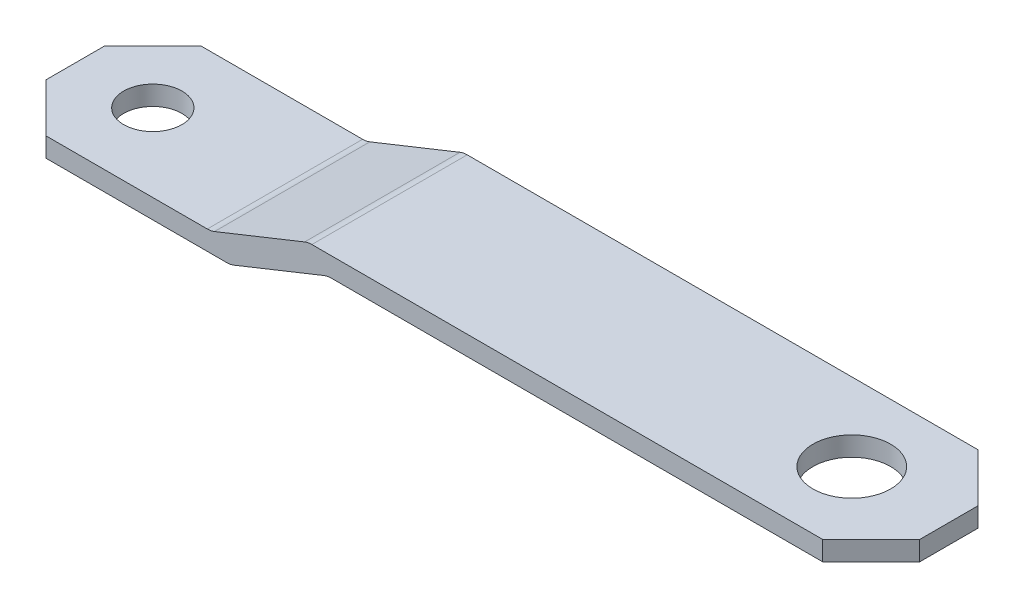
ISO-10303-21;
HEADER;
FILE_DESCRIPTION(('STEP AP214'),'2;1');
FILE_NAME('part.step','',(''),(''),'','','');
FILE_SCHEMA(('AUTOMOTIVE_DESIGN { 1 0 10303 214 1 1 1 1 }'));
ENDSEC;
DATA;
#1=APPLICATION_CONTEXT('core data for automotive mechanical design processes');
#2=APPLICATION_PROTOCOL_DEFINITION('international standard','automotive_design',2000,#1);
#3=PRODUCT_CONTEXT('',#1,'mechanical');
#4=PRODUCT('Part','Part','',(#3));
#5=PRODUCT_RELATED_PRODUCT_CATEGORY('part','',(#4));
#6=PRODUCT_DEFINITION_FORMATION('','',#4);
#7=PRODUCT_DEFINITION_CONTEXT('part definition',#1,'design');
#8=PRODUCT_DEFINITION('design','',#6,#7);
#9=PRODUCT_DEFINITION_SHAPE('','',#8);
#10=(LENGTH_UNIT() NAMED_UNIT(*) SI_UNIT(.MILLI.,.METRE.));
#11=(NAMED_UNIT(*) PLANE_ANGLE_UNIT() SI_UNIT($,.RADIAN.));
#12=(NAMED_UNIT(*) SI_UNIT($,.STERADIAN.) SOLID_ANGLE_UNIT());
#13=UNCERTAINTY_MEASURE_WITH_UNIT(LENGTH_MEASURE(1.E-05),#10,'distance_accuracy_value','');
#14=(GEOMETRIC_REPRESENTATION_CONTEXT(3) GLOBAL_UNCERTAINTY_ASSIGNED_CONTEXT((#13)) GLOBAL_UNIT_ASSIGNED_CONTEXT((#10,
#11,#12)) REPRESENTATION_CONTEXT('',''));
#15=CARTESIAN_POINT('',(0.,0.,0.));
#16=DIRECTION('',(0.,0.,1.));
#17=DIRECTION('',(1.,0.,0.));
#18=AXIS2_PLACEMENT_3D('',#15,#16,#17);
#19=CARTESIAN_POINT('',(0.,2.,16.));
#20=DIRECTION('',(1.,0.,0.));
#21=DIRECTION('',(0.,1.,0.));
#22=AXIS2_PLACEMENT_3D('',#19,#20,#21);
#23=PLANE('',#22);
#24=DIRECTION('',(0.,0.,-1.));
#25=VECTOR('',#24,1.);
#26=CARTESIAN_POINT('',(0.,0.,16.));
#27=LINE('',#26,#25);
#28=CARTESIAN_POINT('',(0.,0.,11.));
#29=VERTEX_POINT('',#28);
#30=CARTESIAN_POINT('',(0.,0.,5.00000000000001));
#31=VERTEX_POINT('',#30);
#32=EDGE_CURVE('E200',#29,#31,#27,.T.);
#33=ORIENTED_EDGE('',*,*,#32,.F.);
#34=DIRECTION('',(0.,1.,0.));
#35=VECTOR('',#34,1.);
#36=CARTESIAN_POINT('',(0.,2.,11.));
#37=LINE('',#36,#35);
#38=CARTESIAN_POINT('',(0.,2.,11.));
#39=VERTEX_POINT('',#38);
#40=EDGE_CURVE('E42',#29,#39,#37,.T.);
#41=ORIENTED_EDGE('',*,*,#40,.T.);
#42=DIRECTION('',(0.,0.,-1.));
#43=VECTOR('',#42,1.);
#44=CARTESIAN_POINT('',(0.,2.,16.));
#45=LINE('',#44,#43);
#46=CARTESIAN_POINT('',(0.,2.,5.00000000000001));
#47=VERTEX_POINT('',#46);
#48=EDGE_CURVE('E194',#39,#47,#45,.T.);
#49=ORIENTED_EDGE('',*,*,#48,.T.);
#50=DIRECTION('',(0.,-1.,0.));
#51=VECTOR('',#50,1.);
#52=CARTESIAN_POINT('',(0.,2.,5.));
#53=LINE('',#52,#51);
#54=EDGE_CURVE('E260',#47,#31,#53,.T.);
#55=ORIENTED_EDGE('',*,*,#54,.T.);
#56=EDGE_LOOP('',(#33,#41,#49,#55));
#57=FACE_BOUND('',#56,.T.);
#58=ADVANCED_FACE('F35',(#57),#23,.F.);
#59=CARTESIAN_POINT('',(0.,0.,16.));
#60=DIRECTION('',(0.,1.,0.));
#61=DIRECTION('',(0.,0.,1.));
#62=AXIS2_PLACEMENT_3D('',#59,#60,#61);
#63=PLANE('',#62);
#64=CARTESIAN_POINT('',(8.,0.,8.));
#65=DIRECTION('',(0.,-1.,0.));
#66=DIRECTION('',(0.,0.,-1.));
#67=AXIS2_PLACEMENT_3D('',#64,#65,#66);
#68=CIRCLE('',#67,3.);
#69=CARTESIAN_POINT('',(8.,0.,5.));
#70=VERTEX_POINT('',#69);
#71=EDGE_CURVE('E237',#70,#70,#68,.T.);
#72=ORIENTED_EDGE('',*,*,#71,.F.);
#73=EDGE_LOOP('',(#72));
#74=FACE_BOUND('',#73,.T.);
#75=DIRECTION('',(1.,0.,0.));
#76=VECTOR('',#75,1.);
#77=CARTESIAN_POINT('',(0.,0.,16.));
#78=LINE('',#77,#76);
#79=CARTESIAN_POINT('',(5.,0.,16.));
#80=VERTEX_POINT('',#79);
#81=CARTESIAN_POINT('',(23.6148351928655,0.,16.));
#82=VERTEX_POINT('',#81);
#83=EDGE_CURVE('E175',#80,#82,#78,.T.);
#84=ORIENTED_EDGE('',*,*,#83,.F.);
#85=DIRECTION('',(-0.707106781186546,0.,-0.707106781186549));
#86=VECTOR('',#85,1.);
#87=CARTESIAN_POINT('',(5.,0.,16.));
#88=LINE('',#87,#86);
#89=EDGE_CURVE('E56',#80,#29,#88,.T.);
#90=ORIENTED_EDGE('',*,*,#89,.T.);
#91=ORIENTED_EDGE('',*,*,#32,.T.);
#92=DIRECTION('',(-0.707106781186549,0.,0.707106781186546));
#93=VECTOR('',#92,1.);
#94=CARTESIAN_POINT('',(0.,0.,5.));
#95=LINE('',#94,#93);
#96=CARTESIAN_POINT('',(5.00000000000002,0.,0.));
#97=VERTEX_POINT('',#96);
#98=EDGE_CURVE('E263',#31,#97,#95,.F.);
#99=ORIENTED_EDGE('',*,*,#98,.T.);
#100=DIRECTION('',(1.,0.,0.));
#101=VECTOR('',#100,1.);
#102=CARTESIAN_POINT('',(0.,0.,0.));
#103=LINE('',#102,#101);
#104=CARTESIAN_POINT('',(23.6148351928655,0.,0.));
#105=VERTEX_POINT('',#104);
#106=EDGE_CURVE('E236',#97,#105,#103,.T.);
#107=ORIENTED_EDGE('',*,*,#106,.T.);
#108=DIRECTION('',(0.,0.,-1.));
#109=VECTOR('',#108,1.);
#110=CARTESIAN_POINT('',(23.6148351928655,0.,16.));
#111=LINE('',#110,#109);
#112=EDGE_CURVE('E223',#105,#82,#111,.F.);
#113=ORIENTED_EDGE('',*,*,#112,.T.);
#114=EDGE_LOOP('',(#84,#90,#91,#99,#107,#113));
#115=FACE_BOUND('',#114,.T.);
#116=ADVANCED_FACE('F279',(#74,#115),#63,.F.);
#117=CARTESIAN_POINT('',(24.,0.,16.));
#118=DIRECTION('',(-0.371390676354103,0.928476690885259,0.));
#119=DIRECTION('',(-0.92847669088526,-0.371390676354103,0.));
#120=AXIS2_PLACEMENT_3D('',#117,#118,#119);
#121=PLANE('',#120);
#122=DIRECTION('',(0.928476690885259,0.371390676354103,0.));
#123=VECTOR('',#122,1.);
#124=CARTESIAN_POINT('',(24.,0.,0.));
#125=LINE('',#124,#123);
#126=CARTESIAN_POINT('',(24.3576165455737,0.143046618229481,0.));
#127=VERTEX_POINT('',#126);
#128=CARTESIAN_POINT('',(33.6423834544263,3.85695338177051,0.));
#129=VERTEX_POINT('',#128);
#130=EDGE_CURVE('E292',#127,#129,#125,.T.);
#131=ORIENTED_EDGE('',*,*,#130,.T.);
#132=DIRECTION('',(0.,0.,-1.));
#133=VECTOR('',#132,1.);
#134=CARTESIAN_POINT('',(33.6423834544263,3.85695338177051,16.));
#135=LINE('',#134,#133);
#136=CARTESIAN_POINT('',(33.6423834544263,3.85695338177051,16.));
#137=VERTEX_POINT('',#136);
#138=EDGE_CURVE('E218',#129,#137,#135,.F.);
#139=ORIENTED_EDGE('',*,*,#138,.T.);
#140=DIRECTION('',(0.928476690885259,0.371390676354103,0.));
#141=VECTOR('',#140,1.);
#142=CARTESIAN_POINT('',(24.,0.,16.));
#143=LINE('',#142,#141);
#144=CARTESIAN_POINT('',(24.3576165455737,0.143046618229481,16.));
#145=VERTEX_POINT('',#144);
#146=EDGE_CURVE('E182',#145,#137,#143,.T.);
#147=ORIENTED_EDGE('',*,*,#146,.F.);
#148=DIRECTION('',(0.,0.,-1.));
#149=VECTOR('',#148,1.);
#150=CARTESIAN_POINT('',(24.3576165455737,0.143046618229481,16.));
#151=LINE('',#150,#149);
#152=EDGE_CURVE('E215',#145,#127,#151,.T.);
#153=ORIENTED_EDGE('',*,*,#152,.T.);
#154=EDGE_LOOP('',(#131,#139,#147,#153));
#155=FACE_BOUND('',#154,.T.);
#156=ADVANCED_FACE('F289',(#155),#121,.F.);
#157=CARTESIAN_POINT('',(34.,3.99999999999999,16.));
#158=DIRECTION('',(0.,1.,0.));
#159=DIRECTION('',(0.,0.,1.));
#160=AXIS2_PLACEMENT_3D('',#157,#158,#159);
#161=PLANE('',#160);
#162=CARTESIAN_POINT('',(80.,3.99999999999999,8.));
#163=DIRECTION('',(0.,1.,0.));
#164=DIRECTION('',(0.,0.,1.));
#165=AXIS2_PLACEMENT_3D('',#162,#163,#164);
#166=CIRCLE('',#165,4.00000000000001);
#167=CARTESIAN_POINT('',(80.,3.99999999999999,12.));
#168=VERTEX_POINT('',#167);
#169=EDGE_CURVE('E241',#168,#168,#166,.T.);
#170=ORIENTED_EDGE('',*,*,#169,.T.);
#171=EDGE_LOOP('',(#170));
#172=FACE_BOUND('',#171,.T.);
#173=DIRECTION('',(0.,0.,-1.));
#174=VECTOR('',#173,1.);
#175=CARTESIAN_POINT('',(90.,3.99999999999999,16.));
#176=LINE('',#175,#174);
#177=CARTESIAN_POINT('',(90.,3.99999999999999,11.));
#178=VERTEX_POINT('',#177);
#179=CARTESIAN_POINT('',(90.,3.99999999999999,5.00000000000001));
#180=VERTEX_POINT('',#179);
#181=EDGE_CURVE('E198',#178,#180,#176,.T.);
#182=ORIENTED_EDGE('',*,*,#181,.F.);
#183=DIRECTION('',(-0.707106781186547,0.,0.707106781186548));
#184=VECTOR('',#183,1.);
#185=CARTESIAN_POINT('',(85.,3.99999999999999,16.));
#186=LINE('',#185,#184);
#187=CARTESIAN_POINT('',(85.,3.99999999999999,16.));
#188=VERTEX_POINT('',#187);
#189=EDGE_CURVE('E258',#178,#188,#186,.T.);
#190=ORIENTED_EDGE('',*,*,#189,.T.);
#191=DIRECTION('',(1.,0.,0.));
#192=VECTOR('',#191,1.);
#193=CARTESIAN_POINT('',(34.,3.99999999999999,16.));
#194=LINE('',#193,#192);
#195=CARTESIAN_POINT('',(34.3851648071345,3.99999999999999,16.));
#196=VERTEX_POINT('',#195);
#197=EDGE_CURVE('E185',#196,#188,#194,.T.);
#198=ORIENTED_EDGE('',*,*,#197,.F.);
#199=DIRECTION('',(0.,0.,-1.));
#200=VECTOR('',#199,1.);
#201=CARTESIAN_POINT('',(34.3851648071345,3.99999999999999,0.));
#202=LINE('',#201,#200);
#203=CARTESIAN_POINT('',(34.3851648071345,3.99999999999999,0.));
#204=VERTEX_POINT('',#203);
#205=EDGE_CURVE('E212',#196,#204,#202,.T.);
#206=ORIENTED_EDGE('',*,*,#205,.T.);
#207=DIRECTION('',(1.,0.,0.));
#208=VECTOR('',#207,1.);
#209=CARTESIAN_POINT('',(34.,3.99999999999999,0.));
#210=LINE('',#209,#208);
#211=CARTESIAN_POINT('',(85.,3.99999999999999,0.));
#212=VERTEX_POINT('',#211);
#213=EDGE_CURVE('E177',#204,#212,#210,.T.);
#214=ORIENTED_EDGE('',*,*,#213,.T.);
#215=DIRECTION('',(-0.707106781186549,0.,-0.707106781186547));
#216=VECTOR('',#215,1.);
#217=CARTESIAN_POINT('',(90.,3.99999999999999,5.));
#218=LINE('',#217,#216);
#219=EDGE_CURVE('E248',#212,#180,#218,.F.);
#220=ORIENTED_EDGE('',*,*,#219,.T.);
#221=EDGE_LOOP('',(#182,#190,#198,#206,#214,#220));
#222=FACE_BOUND('',#221,.T.);
#223=ADVANCED_FACE('F300',(#172,#222),#161,.F.);
#224=CARTESIAN_POINT('',(90.,3.99999999999999,16.));
#225=DIRECTION('',(-1.,0.,0.));
#226=DIRECTION('',(0.,0.,1.));
#227=AXIS2_PLACEMENT_3D('',#224,#225,#226);
#228=PLANE('',#227);
#229=DIRECTION('',(0.,0.,-1.));
#230=VECTOR('',#229,1.);
#231=CARTESIAN_POINT('',(90.,6.,16.));
#232=LINE('',#231,#230);
#233=CARTESIAN_POINT('',(90.,6.,11.));
#234=VERTEX_POINT('',#233);
#235=CARTESIAN_POINT('',(90.,6.,5.00000000000001));
#236=VERTEX_POINT('',#235);
#237=EDGE_CURVE('E196',#234,#236,#232,.T.);
#238=ORIENTED_EDGE('',*,*,#237,.F.);
#239=DIRECTION('',(0.,-1.,0.));
#240=VECTOR('',#239,1.);
#241=CARTESIAN_POINT('',(90.,3.99999999999999,11.));
#242=LINE('',#241,#240);
#243=EDGE_CURVE('E256',#234,#178,#242,.T.);
#244=ORIENTED_EDGE('',*,*,#243,.T.);
#245=ORIENTED_EDGE('',*,*,#181,.T.);
#246=DIRECTION('',(0.,1.,0.));
#247=VECTOR('',#246,1.);
#248=CARTESIAN_POINT('',(90.,3.99999999999999,5.));
#249=LINE('',#248,#247);
#250=EDGE_CURVE('E232',#180,#236,#249,.T.);
#251=ORIENTED_EDGE('',*,*,#250,.T.);
#252=EDGE_LOOP('',(#238,#244,#245,#251));
#253=FACE_BOUND('',#252,.T.);
#254=ADVANCED_FACE('F343',(#253),#228,.F.);
#255=CARTESIAN_POINT('',(90.,6.,16.));
#256=DIRECTION('',(0.,-1.,0.));
#257=DIRECTION('',(1.,0.,0.));
#258=AXIS2_PLACEMENT_3D('',#255,#256,#257);
#259=PLANE('',#258);
#260=CARTESIAN_POINT('',(80.,6.,8.));
#261=DIRECTION('',(0.,-1.,0.));
#262=DIRECTION('',(1.,0.,0.));
#263=AXIS2_PLACEMENT_3D('',#260,#261,#262);
#264=CIRCLE('',#263,4.00000000000001);
#265=CARTESIAN_POINT('',(84.,6.,8.));
#266=VERTEX_POINT('',#265);
#267=EDGE_CURVE('E238',#266,#266,#264,.T.);
#268=ORIENTED_EDGE('',*,*,#267,.T.);
#269=EDGE_LOOP('',(#268));
#270=FACE_BOUND('',#269,.T.);
#271=DIRECTION('',(-1.,0.,0.));
#272=VECTOR('',#271,1.);
#273=CARTESIAN_POINT('',(90.,6.,16.));
#274=LINE('',#273,#272);
#275=CARTESIAN_POINT('',(85.,6.,16.));
#276=VERTEX_POINT('',#275);
#277=CARTESIAN_POINT('',(32.3851648071345,5.99999999999999,16.));
#278=VERTEX_POINT('',#277);
#279=EDGE_CURVE('E188',#276,#278,#274,.T.);
#280=ORIENTED_EDGE('',*,*,#279,.F.);
#281=DIRECTION('',(0.707106781186547,0.,-0.707106781186548));
#282=VECTOR('',#281,1.);
#283=CARTESIAN_POINT('',(85.,6.,16.));
#284=LINE('',#283,#282);
#285=EDGE_CURVE('E254',#276,#234,#284,.T.);
#286=ORIENTED_EDGE('',*,*,#285,.T.);
#287=ORIENTED_EDGE('',*,*,#237,.T.);
#288=DIRECTION('',(0.707106781186549,0.,0.707106781186547));
#289=VECTOR('',#288,1.);
#290=CARTESIAN_POINT('',(90.,6.,5.));
#291=LINE('',#290,#289);
#292=CARTESIAN_POINT('',(85.,6.,0.));
#293=VERTEX_POINT('',#292);
#294=EDGE_CURVE('E244',#236,#293,#291,.F.);
#295=ORIENTED_EDGE('',*,*,#294,.T.);
#296=DIRECTION('',(-1.,0.,0.));
#297=VECTOR('',#296,1.);
#298=CARTESIAN_POINT('',(90.,6.,0.));
#299=LINE('',#298,#297);
#300=CARTESIAN_POINT('',(32.3851648071345,5.99999999999999,0.));
#301=VERTEX_POINT('',#300);
#302=EDGE_CURVE('E172',#293,#301,#299,.T.);
#303=ORIENTED_EDGE('',*,*,#302,.T.);
#304=DIRECTION('',(0.,0.,-1.));
#305=VECTOR('',#304,1.);
#306=CARTESIAN_POINT('',(32.3851648071345,5.99999999999999,16.));
#307=LINE('',#306,#305);
#308=EDGE_CURVE('E152',#301,#278,#307,.F.);
#309=ORIENTED_EDGE('',*,*,#308,.T.);
#310=EDGE_LOOP('',(#280,#286,#287,#295,#303,#309));
#311=FACE_BOUND('',#310,.T.);
#312=ADVANCED_FACE('F309',(#270,#311),#259,.F.);
#313=CARTESIAN_POINT('',(32.,5.99999999999999,16.));
#314=DIRECTION('',(0.371390676354103,-0.928476690885259,0.));
#315=DIRECTION('',(0.92847669088526,0.371390676354103,0.));
#316=AXIS2_PLACEMENT_3D('',#313,#314,#315);
#317=PLANE('',#316);
#318=DIRECTION('',(-0.928476690885259,-0.371390676354103,0.));
#319=VECTOR('',#318,1.);
#320=CARTESIAN_POINT('',(32.,5.99999999999999,16.));
#321=LINE('',#320,#319);
#322=CARTESIAN_POINT('',(31.6423834544263,5.85695338177051,16.));
#323=VERTEX_POINT('',#322);
#324=CARTESIAN_POINT('',(22.3576165455737,2.14304661822948,16.));
#325=VERTEX_POINT('',#324);
#326=EDGE_CURVE('E164',#323,#325,#321,.T.);
#327=ORIENTED_EDGE('',*,*,#326,.F.);
#328=DIRECTION('',(0.,0.,-1.));
#329=VECTOR('',#328,1.);
#330=CARTESIAN_POINT('',(31.6423834544263,5.85695338177051,16.));
#331=LINE('',#330,#329);
#332=CARTESIAN_POINT('',(31.6423834544263,5.85695338177051,0.));
#333=VERTEX_POINT('',#332);
#334=EDGE_CURVE('E150',#323,#333,#331,.T.);
#335=ORIENTED_EDGE('',*,*,#334,.T.);
#336=DIRECTION('',(-0.928476690885259,-0.371390676354103,0.));
#337=VECTOR('',#336,1.);
#338=CARTESIAN_POINT('',(32.,5.99999999999999,0.));
#339=LINE('',#338,#337);
#340=CARTESIAN_POINT('',(22.3576165455737,2.14304661822948,0.));
#341=VERTEX_POINT('',#340);
#342=EDGE_CURVE('E161',#333,#341,#339,.T.);
#343=ORIENTED_EDGE('',*,*,#342,.T.);
#344=DIRECTION('',(0.,0.,-1.));
#345=VECTOR('',#344,1.);
#346=CARTESIAN_POINT('',(22.3576165455737,2.14304661822948,16.));
#347=LINE('',#346,#345);
#348=EDGE_CURVE('E165',#341,#325,#347,.F.);
#349=ORIENTED_EDGE('',*,*,#348,.T.);
#350=EDGE_LOOP('',(#327,#335,#343,#349));
#351=FACE_BOUND('',#350,.T.);
#352=ADVANCED_FACE('F160',(#351),#317,.F.);
#353=CARTESIAN_POINT('',(22.,2.,16.));
#354=DIRECTION('',(0.,-1.,0.));
#355=DIRECTION('',(1.,0.,0.));
#356=AXIS2_PLACEMENT_3D('',#353,#354,#355);
#357=PLANE('',#356);
#358=CARTESIAN_POINT('',(8.,2.,8.));
#359=DIRECTION('',(0.,-1.,0.));
#360=DIRECTION('',(1.,0.,0.));
#361=AXIS2_PLACEMENT_3D('',#358,#359,#360);
#362=CIRCLE('',#361,3.);
#363=CARTESIAN_POINT('',(11.,2.,8.));
#364=VERTEX_POINT('',#363);
#365=EDGE_CURVE('E233',#364,#364,#362,.T.);
#366=ORIENTED_EDGE('',*,*,#365,.T.);
#367=EDGE_LOOP('',(#366));
#368=FACE_BOUND('',#367,.T.);
#369=ORIENTED_EDGE('',*,*,#48,.F.);
#370=DIRECTION('',(0.707106781186546,0.,0.707106781186549));
#371=VECTOR('',#370,1.);
#372=CARTESIAN_POINT('',(5.,2.,16.));
#373=LINE('',#372,#371);
#374=CARTESIAN_POINT('',(5.,2.,16.));
#375=VERTEX_POINT('',#374);
#376=EDGE_CURVE('E11',#39,#375,#373,.T.);
#377=ORIENTED_EDGE('',*,*,#376,.T.);
#378=DIRECTION('',(-1.,0.,0.));
#379=VECTOR('',#378,1.);
#380=CARTESIAN_POINT('',(22.,2.,16.));
#381=LINE('',#380,#379);
#382=CARTESIAN_POINT('',(21.6148351928655,2.,16.));
#383=VERTEX_POINT('',#382);
#384=EDGE_CURVE('E191',#383,#375,#381,.T.);
#385=ORIENTED_EDGE('',*,*,#384,.F.);
#386=DIRECTION('',(0.,0.,-1.));
#387=VECTOR('',#386,1.);
#388=CARTESIAN_POINT('',(21.6148351928655,2.,0.));
#389=LINE('',#388,#387);
#390=CARTESIAN_POINT('',(21.6148351928655,2.,0.));
#391=VERTEX_POINT('',#390);
#392=EDGE_CURVE('E206',#383,#391,#389,.T.);
#393=ORIENTED_EDGE('',*,*,#392,.T.);
#394=DIRECTION('',(-1.,0.,0.));
#395=VECTOR('',#394,1.);
#396=CARTESIAN_POINT('',(22.,2.,0.));
#397=LINE('',#396,#395);
#398=CARTESIAN_POINT('',(5.00000000000003,2.,0.));
#399=VERTEX_POINT('',#398);
#400=EDGE_CURVE('E171',#391,#399,#397,.T.);
#401=ORIENTED_EDGE('',*,*,#400,.T.);
#402=DIRECTION('',(0.707106781186549,0.,-0.707106781186546));
#403=VECTOR('',#402,1.);
#404=CARTESIAN_POINT('',(0.,2.,5.));
#405=LINE('',#404,#403);
#406=EDGE_CURVE('E267',#399,#47,#405,.F.);
#407=ORIENTED_EDGE('',*,*,#406,.T.);
#408=EDGE_LOOP('',(#369,#377,#385,#393,#401,#407));
#409=FACE_BOUND('',#408,.T.);
#410=ADVANCED_FACE('F316',(#368,#409),#357,.F.);
#411=CARTESIAN_POINT('',(0.,0.,16.));
#412=DIRECTION('',(0.,0.,1.));
#413=DIRECTION('',(1.,0.,0.));
#414=AXIS2_PLACEMENT_3D('',#411,#412,#413);
#415=PLANE('',#414);
#416=ORIENTED_EDGE('',*,*,#384,.T.);
#417=DIRECTION('',(0.,-1.,0.));
#418=VECTOR('',#417,1.);
#419=CARTESIAN_POINT('',(5.,0.,16.));
#420=LINE('',#419,#418);
#421=EDGE_CURVE('E270',#375,#80,#420,.T.);
#422=ORIENTED_EDGE('',*,*,#421,.T.);
#423=ORIENTED_EDGE('',*,*,#83,.T.);
#424=CARTESIAN_POINT('',(23.6148351928655,2.,16.));
#425=DIRECTION('',(0.,0.,1.));
#426=DIRECTION('',(1.,0.,0.));
#427=AXIS2_PLACEMENT_3D('',#424,#425,#426);
#428=CIRCLE('',#427,2.);
#429=EDGE_CURVE('E226',#82,#145,#428,.T.);
#430=ORIENTED_EDGE('',*,*,#429,.T.);
#431=ORIENTED_EDGE('',*,*,#146,.T.);
#432=CARTESIAN_POINT('',(34.3851648071345,1.99999999999999,16.));
#433=DIRECTION('',(0.,0.,1.));
#434=DIRECTION('',(1.,0.,0.));
#435=AXIS2_PLACEMENT_3D('',#432,#433,#434);
#436=CIRCLE('',#435,2.);
#437=EDGE_CURVE('E230',#137,#196,#436,.F.);
#438=ORIENTED_EDGE('',*,*,#437,.T.);
#439=ORIENTED_EDGE('',*,*,#197,.T.);
#440=DIRECTION('',(0.,1.,0.));
#441=VECTOR('',#440,1.);
#442=CARTESIAN_POINT('',(85.,6.,16.));
#443=LINE('',#442,#441);
#444=EDGE_CURVE('E251',#188,#276,#443,.T.);
#445=ORIENTED_EDGE('',*,*,#444,.T.);
#446=ORIENTED_EDGE('',*,*,#279,.T.);
#447=CARTESIAN_POINT('',(32.3851648071345,3.99999999999999,16.));
#448=DIRECTION('',(0.,0.,1.));
#449=DIRECTION('',(1.,0.,0.));
#450=AXIS2_PLACEMENT_3D('',#447,#448,#449);
#451=CIRCLE('',#450,2.);
#452=EDGE_CURVE('E204',#278,#323,#451,.T.);
#453=ORIENTED_EDGE('',*,*,#452,.T.);
#454=ORIENTED_EDGE('',*,*,#326,.T.);
#455=CARTESIAN_POINT('',(21.6148351928655,4.,16.));
#456=DIRECTION('',(0.,0.,1.));
#457=DIRECTION('',(1.,0.,0.));
#458=AXIS2_PLACEMENT_3D('',#455,#456,#457);
#459=CIRCLE('',#458,2.);
#460=EDGE_CURVE('E210',#325,#383,#459,.F.);
#461=ORIENTED_EDGE('',*,*,#460,.T.);
#462=EDGE_LOOP('',(#416,#422,#423,#430,#431,#438,#439,#445,#446,#453,#454,#461));
#463=FACE_BOUND('',#462,.T.);
#464=ADVANCED_FACE('F275',(#463),#415,.T.);
#465=CARTESIAN_POINT('',(0.,0.,0.));
#466=DIRECTION('',(0.,0.,1.));
#467=DIRECTION('',(1.,0.,0.));
#468=AXIS2_PLACEMENT_3D('',#465,#466,#467);
#469=PLANE('',#468);
#470=ORIENTED_EDGE('',*,*,#106,.F.);
#471=DIRECTION('',(0.,1.,0.));
#472=VECTOR('',#471,1.);
#473=CARTESIAN_POINT('',(5.00000000000002,0.,0.));
#474=LINE('',#473,#472);
#475=EDGE_CURVE('E265',#97,#399,#474,.T.);
#476=ORIENTED_EDGE('',*,*,#475,.T.);
#477=ORIENTED_EDGE('',*,*,#400,.F.);
#478=CARTESIAN_POINT('',(21.6148351928655,4.,0.));
#479=DIRECTION('',(0.,0.,1.));
#480=DIRECTION('',(1.,0.,0.));
#481=AXIS2_PLACEMENT_3D('',#478,#479,#480);
#482=CIRCLE('',#481,2.);
#483=EDGE_CURVE('E170',#391,#341,#482,.T.);
#484=ORIENTED_EDGE('',*,*,#483,.T.);
#485=ORIENTED_EDGE('',*,*,#342,.F.);
#486=CARTESIAN_POINT('',(32.3851648071345,3.99999999999999,0.));
#487=DIRECTION('',(0.,0.,1.));
#488=DIRECTION('',(1.,0.,0.));
#489=AXIS2_PLACEMENT_3D('',#486,#487,#488);
#490=CIRCLE('',#489,2.);
#491=EDGE_CURVE('E146',#333,#301,#490,.F.);
#492=ORIENTED_EDGE('',*,*,#491,.T.);
#493=ORIENTED_EDGE('',*,*,#302,.F.);
#494=DIRECTION('',(0.,-1.,0.));
#495=VECTOR('',#494,1.);
#496=CARTESIAN_POINT('',(85.,0.,0.));
#497=LINE('',#496,#495);
#498=EDGE_CURVE('E246',#293,#212,#497,.T.);
#499=ORIENTED_EDGE('',*,*,#498,.T.);
#500=ORIENTED_EDGE('',*,*,#213,.F.);
#501=CARTESIAN_POINT('',(34.3851648071345,1.99999999999999,0.));
#502=DIRECTION('',(0.,0.,1.));
#503=DIRECTION('',(1.,0.,0.));
#504=AXIS2_PLACEMENT_3D('',#501,#502,#503);
#505=CIRCLE('',#504,2.);
#506=EDGE_CURVE('E228',#204,#129,#505,.T.);
#507=ORIENTED_EDGE('',*,*,#506,.T.);
#508=ORIENTED_EDGE('',*,*,#130,.F.);
#509=CARTESIAN_POINT('',(23.6148351928655,2.,0.));
#510=DIRECTION('',(0.,0.,1.));
#511=DIRECTION('',(1.,0.,0.));
#512=AXIS2_PLACEMENT_3D('',#509,#510,#511);
#513=CIRCLE('',#512,2.);
#514=EDGE_CURVE('E220',#127,#105,#513,.F.);
#515=ORIENTED_EDGE('',*,*,#514,.T.);
#516=EDGE_LOOP('',(#470,#476,#477,#484,#485,#492,#493,#499,#500,#507,#508,#515));
#517=FACE_BOUND('',#516,.T.);
#518=ADVANCED_FACE('F168',(#517),#469,.F.);
#519=CARTESIAN_POINT('',(32.3851648071345,3.99999999999999,16.));
#520=DIRECTION('',(0.,0.,-1.));
#521=DIRECTION('',(-1.,0.,0.));
#522=AXIS2_PLACEMENT_3D('',#519,#520,#521);
#523=CYLINDRICAL_SURFACE('',#522,2.);
#524=ORIENTED_EDGE('',*,*,#452,.F.);
#525=ORIENTED_EDGE('',*,*,#308,.F.);
#526=ORIENTED_EDGE('',*,*,#491,.F.);
#527=ORIENTED_EDGE('',*,*,#334,.F.);
#528=EDGE_LOOP('',(#524,#525,#526,#527));
#529=FACE_BOUND('',#528,.T.);
#530=ADVANCED_FACE('F149',(#529),#523,.T.);
#531=CARTESIAN_POINT('',(21.6148351928655,4.,16.));
#532=DIRECTION('',(0.,0.,1.));
#533=DIRECTION('',(1.,0.,0.));
#534=AXIS2_PLACEMENT_3D('',#531,#532,#533);
#535=CYLINDRICAL_SURFACE('',#534,2.);
#536=ORIENTED_EDGE('',*,*,#460,.F.);
#537=ORIENTED_EDGE('',*,*,#348,.F.);
#538=ORIENTED_EDGE('',*,*,#483,.F.);
#539=ORIENTED_EDGE('',*,*,#392,.F.);
#540=EDGE_LOOP('',(#536,#537,#538,#539));
#541=FACE_BOUND('',#540,.T.);
#542=ADVANCED_FACE('F314',(#541),#535,.F.);
#543=CARTESIAN_POINT('',(34.3851648071345,1.99999999999999,16.));
#544=DIRECTION('',(0.,0.,1.));
#545=DIRECTION('',(1.,0.,0.));
#546=AXIS2_PLACEMENT_3D('',#543,#544,#545);
#547=CYLINDRICAL_SURFACE('',#546,2.);
#548=ORIENTED_EDGE('',*,*,#437,.F.);
#549=ORIENTED_EDGE('',*,*,#138,.F.);
#550=ORIENTED_EDGE('',*,*,#506,.F.);
#551=ORIENTED_EDGE('',*,*,#205,.F.);
#552=EDGE_LOOP('',(#548,#549,#550,#551));
#553=FACE_BOUND('',#552,.T.);
#554=ADVANCED_FACE('F294',(#553),#547,.F.);
#555=CARTESIAN_POINT('',(23.6148351928655,2.,16.));
#556=DIRECTION('',(0.,0.,-1.));
#557=DIRECTION('',(-1.,0.,0.));
#558=AXIS2_PLACEMENT_3D('',#555,#556,#557);
#559=CYLINDRICAL_SURFACE('',#558,2.);
#560=ORIENTED_EDGE('',*,*,#429,.F.);
#561=ORIENTED_EDGE('',*,*,#112,.F.);
#562=ORIENTED_EDGE('',*,*,#514,.F.);
#563=ORIENTED_EDGE('',*,*,#152,.F.);
#564=EDGE_LOOP('',(#560,#561,#562,#563));
#565=FACE_BOUND('',#564,.T.);
#566=ADVANCED_FACE('F284',(#565),#559,.T.);
#567=CARTESIAN_POINT('',(8.,16.,8.));
#568=DIRECTION('',(0.,-1.,0.));
#569=DIRECTION('',(0.,0.,-1.));
#570=AXIS2_PLACEMENT_3D('',#567,#568,#569);
#571=CYLINDRICAL_SURFACE('',#570,3.);
#572=ORIENTED_EDGE('',*,*,#71,.T.);
#573=EDGE_LOOP('',(#572));
#574=FACE_BOUND('',#573,.T.);
#575=ORIENTED_EDGE('',*,*,#365,.F.);
#576=EDGE_LOOP('',(#575));
#577=FACE_BOUND('',#576,.T.);
#578=ADVANCED_FACE('F368',(#574,#577),#571,.F.);
#579=CARTESIAN_POINT('',(80.,16.,8.));
#580=DIRECTION('',(0.,-1.,0.));
#581=DIRECTION('',(0.,0.,-1.));
#582=AXIS2_PLACEMENT_3D('',#579,#580,#581);
#583=CYLINDRICAL_SURFACE('',#582,4.00000000000001);
#584=ORIENTED_EDGE('',*,*,#267,.F.);
#585=EDGE_LOOP('',(#584));
#586=FACE_BOUND('',#585,.T.);
#587=ORIENTED_EDGE('',*,*,#169,.F.);
#588=EDGE_LOOP('',(#587));
#589=FACE_BOUND('',#588,.T.);
#590=ADVANCED_FACE('F371',(#586,#589),#583,.F.);
#591=CARTESIAN_POINT('',(90.,3.99999999999999,5.));
#592=DIRECTION('',(-0.707106781186547,0.,0.707106781186549));
#593=DIRECTION('',(0.707106781186549,0.,0.707106781186547));
#594=AXIS2_PLACEMENT_3D('',#591,#592,#593);
#595=PLANE('',#594);
#596=ORIENTED_EDGE('',*,*,#219,.F.);
#597=ORIENTED_EDGE('',*,*,#498,.F.);
#598=ORIENTED_EDGE('',*,*,#294,.F.);
#599=ORIENTED_EDGE('',*,*,#250,.F.);
#600=EDGE_LOOP('',(#596,#597,#598,#599));
#601=FACE_BOUND('',#600,.T.);
#602=ADVANCED_FACE('F375',(#601),#595,.F.);
#603=CARTESIAN_POINT('',(85.,0.,16.));
#604=DIRECTION('',(0.707106781186548,0.,0.707106781186547));
#605=DIRECTION('',(0.707106781186547,0.,-0.707106781186548));
#606=AXIS2_PLACEMENT_3D('',#603,#604,#605);
#607=PLANE('',#606);
#608=ORIENTED_EDGE('',*,*,#189,.F.);
#609=ORIENTED_EDGE('',*,*,#243,.F.);
#610=ORIENTED_EDGE('',*,*,#285,.F.);
#611=ORIENTED_EDGE('',*,*,#444,.F.);
#612=EDGE_LOOP('',(#608,#609,#610,#611));
#613=FACE_BOUND('',#612,.T.);
#614=ADVANCED_FACE('F306',(#613),#607,.T.);
#615=CARTESIAN_POINT('',(0.,2.,5.));
#616=DIRECTION('',(0.707106781186546,0.,0.707106781186549));
#617=DIRECTION('',(0.707106781186549,0.,-0.707106781186546));
#618=AXIS2_PLACEMENT_3D('',#615,#616,#617);
#619=PLANE('',#618);
#620=ORIENTED_EDGE('',*,*,#406,.F.);
#621=ORIENTED_EDGE('',*,*,#475,.F.);
#622=ORIENTED_EDGE('',*,*,#98,.F.);
#623=ORIENTED_EDGE('',*,*,#54,.F.);
#624=EDGE_LOOP('',(#620,#621,#622,#623));
#625=FACE_BOUND('',#624,.T.);
#626=ADVANCED_FACE('F321',(#625),#619,.F.);
#627=CARTESIAN_POINT('',(5.,0.,16.));
#628=DIRECTION('',(-0.707106781186549,0.,0.707106781186546));
#629=DIRECTION('',(0.707106781186546,0.,0.707106781186549));
#630=AXIS2_PLACEMENT_3D('',#627,#628,#629);
#631=PLANE('',#630);
#632=ORIENTED_EDGE('',*,*,#376,.F.);
#633=ORIENTED_EDGE('',*,*,#40,.F.);
#634=ORIENTED_EDGE('',*,*,#89,.F.);
#635=ORIENTED_EDGE('',*,*,#421,.F.);
#636=EDGE_LOOP('',(#632,#633,#634,#635));
#637=FACE_BOUND('',#636,.T.);
#638=ADVANCED_FACE('F323',(#637),#631,.T.);
#639=CLOSED_SHELL('',(#58,#116,#156,#223,#254,#312,#352,#410,#464,#518,#530,#542,#554,#566,#578,
#590,#602,#614,#626,#638));
#640=MANIFOLD_SOLID_BREP('B2',#639);
#641=ADVANCED_BREP_SHAPE_REPRESENTATION('',(#18,#640),#14);
#642=SHAPE_DEFINITION_REPRESENTATION(#9,#641);
ENDSEC;
END-ISO-10303-21;
